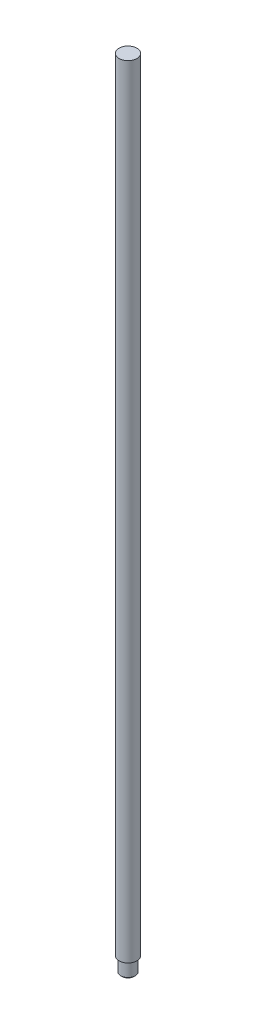
ISO-10303-21;
HEADER;
FILE_DESCRIPTION(('STEP AP214'),'2;1');
FILE_NAME('part.step','',(''),(''),'','','');
FILE_SCHEMA(('AUTOMOTIVE_DESIGN { 1 0 10303 214 1 1 1 1 }'));
ENDSEC;
DATA;
#1=APPLICATION_CONTEXT('core data for automotive mechanical design processes');
#2=APPLICATION_PROTOCOL_DEFINITION('international standard','automotive_design',2000,#1);
#3=PRODUCT_CONTEXT('',#1,'mechanical');
#4=PRODUCT('Part','Part','',(#3));
#5=PRODUCT_RELATED_PRODUCT_CATEGORY('part','',(#4));
#6=PRODUCT_DEFINITION_FORMATION('','',#4);
#7=PRODUCT_DEFINITION_CONTEXT('part definition',#1,'design');
#8=PRODUCT_DEFINITION('design','',#6,#7);
#9=PRODUCT_DEFINITION_SHAPE('','',#8);
#10=(LENGTH_UNIT() NAMED_UNIT(*) SI_UNIT(.MILLI.,.METRE.));
#11=(NAMED_UNIT(*) PLANE_ANGLE_UNIT() SI_UNIT($,.RADIAN.));
#12=(NAMED_UNIT(*) SI_UNIT($,.STERADIAN.) SOLID_ANGLE_UNIT());
#13=UNCERTAINTY_MEASURE_WITH_UNIT(LENGTH_MEASURE(1.E-05),#10,'distance_accuracy_value','');
#14=(GEOMETRIC_REPRESENTATION_CONTEXT(3) GLOBAL_UNCERTAINTY_ASSIGNED_CONTEXT((#13)) GLOBAL_UNIT_ASSIGNED_CONTEXT((#10,
#11,#12)) REPRESENTATION_CONTEXT('',''));
#15=CARTESIAN_POINT('',(0.,0.,0.));
#16=DIRECTION('',(0.,0.,1.));
#17=DIRECTION('',(1.,0.,0.));
#18=AXIS2_PLACEMENT_3D('',#15,#16,#17);
#19=CARTESIAN_POINT('',(0.,431.8,0.));
#20=DIRECTION('',(0.,-1.,0.));
#21=DIRECTION('',(0.,0.,-1.));
#22=AXIS2_PLACEMENT_3D('',#19,#20,#21);
#23=CYLINDRICAL_SURFACE('',#22,4.953);
#24=CARTESIAN_POINT('',(0.,431.8,0.));
#25=DIRECTION('',(0.,1.,0.));
#26=DIRECTION('',(0.,0.,1.));
#27=AXIS2_PLACEMENT_3D('',#24,#25,#26);
#28=CIRCLE('',#27,4.953);
#29=CARTESIAN_POINT('',(0.,431.8,4.953));
#30=VERTEX_POINT('',#29);
#31=EDGE_CURVE('E47',#30,#30,#28,.T.);
#32=ORIENTED_EDGE('',*,*,#31,.F.);
#33=EDGE_LOOP('',(#32));
#34=FACE_BOUND('',#33,.T.);
#35=CARTESIAN_POINT('',(0.,0.,0.));
#36=DIRECTION('',(0.,1.,0.));
#37=DIRECTION('',(0.,0.,1.));
#38=AXIS2_PLACEMENT_3D('',#35,#36,#37);
#39=CIRCLE('',#38,4.953);
#40=CARTESIAN_POINT('',(0.,0.,4.953));
#41=VERTEX_POINT('',#40);
#42=EDGE_CURVE('E50',#41,#41,#39,.T.);
#43=ORIENTED_EDGE('',*,*,#42,.T.);
#44=EDGE_LOOP('',(#43));
#45=FACE_BOUND('',#44,.T.);
#46=ADVANCED_FACE('F32',(#34,#45),#23,.T.);
#47=CARTESIAN_POINT('',(0.,431.8,0.));
#48=DIRECTION('',(0.,1.,0.));
#49=DIRECTION('',(0.,0.,1.));
#50=AXIS2_PLACEMENT_3D('',#47,#48,#49);
#51=PLANE('',#50);
#52=ORIENTED_EDGE('',*,*,#31,.T.);
#53=EDGE_LOOP('',(#52));
#54=FACE_BOUND('',#53,.T.);
#55=ADVANCED_FACE('F56',(#54),#51,.T.);
#56=CARTESIAN_POINT('',(0.,0.,0.));
#57=DIRECTION('',(0.,1.,0.));
#58=DIRECTION('',(0.,0.,1.));
#59=AXIS2_PLACEMENT_3D('',#56,#57,#58);
#60=PLANE('',#59);
#61=CARTESIAN_POINT('',(0.,0.,0.));
#62=DIRECTION('',(0.,1.,0.));
#63=DIRECTION('',(0.,0.,1.));
#64=AXIS2_PLACEMENT_3D('',#61,#62,#63);
#65=CIRCLE('',#64,4.);
#66=CARTESIAN_POINT('',(0.,0.,4.));
#67=VERTEX_POINT('',#66);
#68=EDGE_CURVE('E43',#67,#67,#65,.F.);
#69=ORIENTED_EDGE('',*,*,#68,.F.);
#70=EDGE_LOOP('',(#69));
#71=FACE_BOUND('',#70,.T.);
#72=ORIENTED_EDGE('',*,*,#42,.F.);
#73=EDGE_LOOP('',(#72));
#74=FACE_BOUND('',#73,.T.);
#75=ADVANCED_FACE('F62',(#71,#74),#60,.F.);
#76=CARTESIAN_POINT('',(0.,-8.382,0.));
#77=DIRECTION('',(0.,1.,0.));
#78=DIRECTION('',(0.,0.,1.));
#79=AXIS2_PLACEMENT_3D('',#76,#77,#78);
#80=CYLINDRICAL_SURFACE('',#79,4.);
#81=CARTESIAN_POINT('',(0.,-7.62000000000006,0.));
#82=DIRECTION('',(0.,-1.,0.));
#83=DIRECTION('',(0.,0.,-1.));
#84=AXIS2_PLACEMENT_3D('',#81,#82,#83);
#85=CIRCLE('',#84,4.);
#86=CARTESIAN_POINT('',(0.,-7.62000000000006,-4.));
#87=VERTEX_POINT('',#86);
#88=EDGE_CURVE('E10',#87,#87,#85,.F.);
#89=ORIENTED_EDGE('',*,*,#88,.T.);
#90=EDGE_LOOP('',(#89));
#91=FACE_BOUND('',#90,.T.);
#92=ORIENTED_EDGE('',*,*,#68,.T.);
#93=EDGE_LOOP('',(#92));
#94=FACE_BOUND('',#93,.T.);
#95=ADVANCED_FACE('F64',(#91,#94),#80,.T.);
#96=CARTESIAN_POINT('',(0.,-8.382,0.));
#97=DIRECTION('',(0.,-1.,0.));
#98=DIRECTION('',(0.,0.,-1.));
#99=AXIS2_PLACEMENT_3D('',#96,#97,#98);
#100=PLANE('',#99);
#101=CARTESIAN_POINT('',(0.,-8.382,0.));
#102=DIRECTION('',(0.,-1.,0.));
#103=DIRECTION('',(0.,0.,-1.));
#104=AXIS2_PLACEMENT_3D('',#101,#102,#103);
#105=CIRCLE('',#104,3.23800000000002);
#106=CARTESIAN_POINT('',(0.,-8.382,-3.23800000000002));
#107=VERTEX_POINT('',#106);
#108=EDGE_CURVE('E39',#107,#107,#105,.T.);
#109=ORIENTED_EDGE('',*,*,#108,.T.);
#110=EDGE_LOOP('',(#109));
#111=FACE_BOUND('',#110,.T.);
#112=ADVANCED_FACE('F71',(#111),#100,.T.);
#113=CARTESIAN_POINT('',(0.,-8.382,0.));
#114=DIRECTION('',(0.,1.,0.));
#115=DIRECTION('',(0.,0.,1.));
#116=AXIS2_PLACEMENT_3D('',#113,#114,#115);
#117=CONICAL_SURFACE('',#116,3.23800000000002,0.785398163397476);
#118=ORIENTED_EDGE('',*,*,#88,.F.);
#119=EDGE_LOOP('',(#118));
#120=FACE_BOUND('',#119,.T.);
#121=ORIENTED_EDGE('',*,*,#108,.F.);
#122=EDGE_LOOP('',(#121));
#123=FACE_BOUND('',#122,.T.);
#124=ADVANCED_FACE('F34',(#120,#123),#117,.T.);
#125=CLOSED_SHELL('',(#46,#55,#75,#95,#112,#124));
#126=MANIFOLD_SOLID_BREP('B2',#125);
#127=ADVANCED_BREP_SHAPE_REPRESENTATION('',(#18,#126),#14);
#128=SHAPE_DEFINITION_REPRESENTATION(#9,#127);
ENDSEC;
END-ISO-10303-21;
